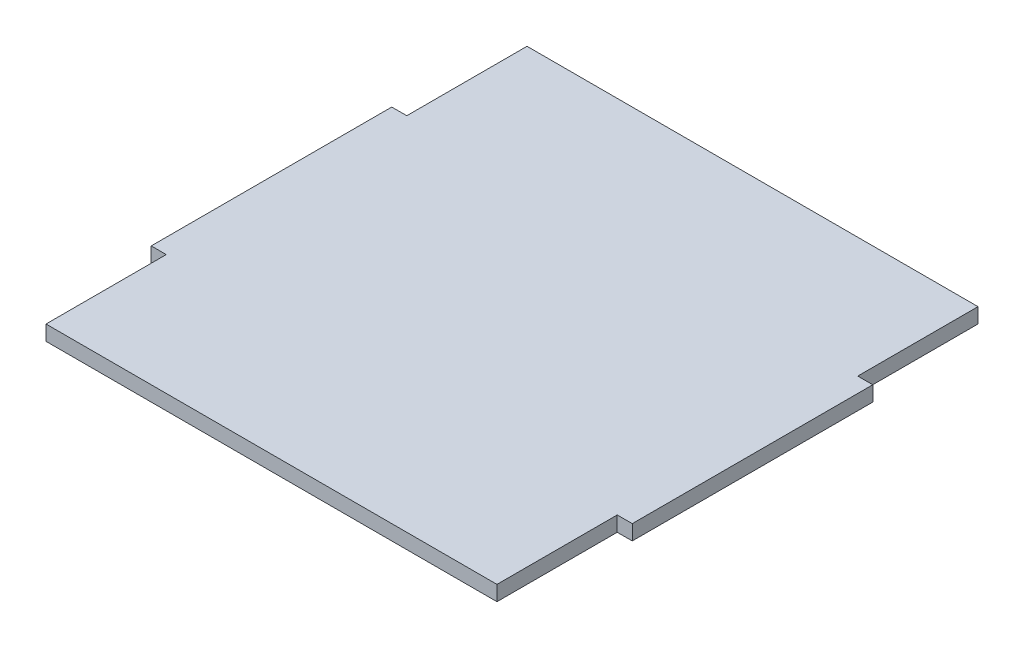
ISO-10303-21;
HEADER;
FILE_DESCRIPTION(('STEP AP214'),'2;1');
FILE_NAME('part.step','',(''),(''),'','','');
FILE_SCHEMA(('AUTOMOTIVE_DESIGN { 1 0 10303 214 1 1 1 1 }'));
ENDSEC;
DATA;
#1=APPLICATION_CONTEXT('core data for automotive mechanical design processes');
#2=APPLICATION_PROTOCOL_DEFINITION('international standard','automotive_design',2000,#1);
#3=PRODUCT_CONTEXT('',#1,'mechanical');
#4=PRODUCT('Part','Part','',(#3));
#5=PRODUCT_RELATED_PRODUCT_CATEGORY('part','',(#4));
#6=PRODUCT_DEFINITION_FORMATION('','',#4);
#7=PRODUCT_DEFINITION_CONTEXT('part definition',#1,'design');
#8=PRODUCT_DEFINITION('design','',#6,#7);
#9=PRODUCT_DEFINITION_SHAPE('','',#8);
#10=(LENGTH_UNIT() NAMED_UNIT(*) SI_UNIT(.MILLI.,.METRE.));
#11=(NAMED_UNIT(*) PLANE_ANGLE_UNIT() SI_UNIT($,.RADIAN.));
#12=(NAMED_UNIT(*) SI_UNIT($,.STERADIAN.) SOLID_ANGLE_UNIT());
#13=UNCERTAINTY_MEASURE_WITH_UNIT(LENGTH_MEASURE(1.E-05),#10,'distance_accuracy_value','');
#14=(GEOMETRIC_REPRESENTATION_CONTEXT(3) GLOBAL_UNCERTAINTY_ASSIGNED_CONTEXT((#13)) GLOBAL_UNIT_ASSIGNED_CONTEXT((#10,
#11,#12)) REPRESENTATION_CONTEXT('',''));
#15=CARTESIAN_POINT('',(0.,0.,0.));
#16=DIRECTION('',(0.,0.,1.));
#17=DIRECTION('',(1.,0.,0.));
#18=AXIS2_PLACEMENT_3D('',#15,#16,#17);
#19=CARTESIAN_POINT('',(98.425,3.175,0.));
#20=DIRECTION('',(1.,0.,0.));
#21=DIRECTION('',(0.,0.,-1.));
#22=AXIS2_PLACEMENT_3D('',#19,#20,#21);
#23=PLANE('',#22);
#24=DIRECTION('',(0.,0.,1.));
#25=VECTOR('',#24,1.);
#26=CARTESIAN_POINT('',(98.425,0.,0.));
#27=LINE('',#26,#25);
#28=CARTESIAN_POINT('',(98.425,0.,-101.6));
#29=VERTEX_POINT('',#28);
#30=CARTESIAN_POINT('',(98.425,0.,-76.2));
#31=VERTEX_POINT('',#30);
#32=EDGE_CURVE('E150',#29,#31,#27,.T.);
#33=ORIENTED_EDGE('',*,*,#32,.F.);
#34=DIRECTION('',(0.,-1.,0.));
#35=VECTOR('',#34,1.);
#36=CARTESIAN_POINT('',(98.425,3.175,-101.6));
#37=LINE('',#36,#35);
#38=CARTESIAN_POINT('',(98.425,3.175,-101.6));
#39=VERTEX_POINT('',#38);
#40=EDGE_CURVE('E11',#39,#29,#37,.T.);
#41=ORIENTED_EDGE('',*,*,#40,.F.);
#42=DIRECTION('',(0.,0.,1.));
#43=VECTOR('',#42,1.);
#44=CARTESIAN_POINT('',(98.425,3.175,0.));
#45=LINE('',#44,#43);
#46=CARTESIAN_POINT('',(98.425,3.175,-76.2));
#47=VERTEX_POINT('',#46);
#48=EDGE_CURVE('E178',#39,#47,#45,.T.);
#49=ORIENTED_EDGE('',*,*,#48,.T.);
#50=DIRECTION('',(0.,-1.,0.));
#51=VECTOR('',#50,1.);
#52=CARTESIAN_POINT('',(98.425,3.175,-76.2));
#53=LINE('',#52,#51);
#54=EDGE_CURVE('E95',#47,#31,#53,.T.);
#55=ORIENTED_EDGE('',*,*,#54,.T.);
#56=EDGE_LOOP('',(#33,#41,#49,#55));
#57=FACE_BOUND('',#56,.T.);
#58=ADVANCED_FACE('F33',(#57),#23,.T.);
#59=CARTESIAN_POINT('',(0.,3.175,-101.6));
#60=DIRECTION('',(0.,0.,-1.));
#61=DIRECTION('',(-1.,0.,0.));
#62=AXIS2_PLACEMENT_3D('',#59,#60,#61);
#63=PLANE('',#62);
#64=DIRECTION('',(1.,0.,0.));
#65=VECTOR('',#64,1.);
#66=CARTESIAN_POINT('',(0.,0.,-101.6));
#67=LINE('',#66,#65);
#68=CARTESIAN_POINT('',(3.175,0.,-101.6));
#69=VERTEX_POINT('',#68);
#70=EDGE_CURVE('E153',#69,#29,#67,.T.);
#71=ORIENTED_EDGE('',*,*,#70,.F.);
#72=DIRECTION('',(0.,-1.,0.));
#73=VECTOR('',#72,1.);
#74=CARTESIAN_POINT('',(3.175,3.175,-101.6));
#75=LINE('',#74,#73);
#76=CARTESIAN_POINT('',(3.175,3.175,-101.6));
#77=VERTEX_POINT('',#76);
#78=EDGE_CURVE('E41',#77,#69,#75,.T.);
#79=ORIENTED_EDGE('',*,*,#78,.F.);
#80=DIRECTION('',(1.,0.,0.));
#81=VECTOR('',#80,1.);
#82=CARTESIAN_POINT('',(0.,3.175,-101.6));
#83=LINE('',#82,#81);
#84=EDGE_CURVE('E219',#77,#39,#83,.T.);
#85=ORIENTED_EDGE('',*,*,#84,.T.);
#86=ORIENTED_EDGE('',*,*,#40,.T.);
#87=EDGE_LOOP('',(#71,#79,#85,#86));
#88=FACE_BOUND('',#87,.T.);
#89=ADVANCED_FACE('F206',(#88),#63,.T.);
#90=CARTESIAN_POINT('',(3.175,3.175,0.));
#91=DIRECTION('',(-1.,0.,0.));
#92=DIRECTION('',(0.,0.,1.));
#93=AXIS2_PLACEMENT_3D('',#90,#91,#92);
#94=PLANE('',#93);
#95=DIRECTION('',(0.,0.,-1.));
#96=VECTOR('',#95,1.);
#97=CARTESIAN_POINT('',(3.175,0.,0.));
#98=LINE('',#97,#96);
#99=CARTESIAN_POINT('',(3.175,0.,-76.2));
#100=VERTEX_POINT('',#99);
#101=EDGE_CURVE('E156',#100,#69,#98,.T.);
#102=ORIENTED_EDGE('',*,*,#101,.F.);
#103=DIRECTION('',(0.,-1.,0.));
#104=VECTOR('',#103,1.);
#105=CARTESIAN_POINT('',(3.175,3.175,-76.2));
#106=LINE('',#105,#104);
#107=CARTESIAN_POINT('',(3.175,3.175,-76.2));
#108=VERTEX_POINT('',#107);
#109=EDGE_CURVE('E195',#108,#100,#106,.T.);
#110=ORIENTED_EDGE('',*,*,#109,.F.);
#111=DIRECTION('',(0.,0.,-1.));
#112=VECTOR('',#111,1.);
#113=CARTESIAN_POINT('',(3.175,3.175,0.));
#114=LINE('',#113,#112);
#115=EDGE_CURVE('E202',#108,#77,#114,.T.);
#116=ORIENTED_EDGE('',*,*,#115,.T.);
#117=ORIENTED_EDGE('',*,*,#78,.T.);
#118=EDGE_LOOP('',(#102,#110,#116,#117));
#119=FACE_BOUND('',#118,.T.);
#120=ADVANCED_FACE('F200',(#119),#94,.T.);
#121=CARTESIAN_POINT('',(0.,3.175,-76.2));
#122=DIRECTION('',(0.,0.,-1.));
#123=DIRECTION('',(-1.,0.,0.));
#124=AXIS2_PLACEMENT_3D('',#121,#122,#123);
#125=PLANE('',#124);
#126=DIRECTION('',(1.,0.,0.));
#127=VECTOR('',#126,1.);
#128=CARTESIAN_POINT('',(0.,0.,-76.2));
#129=LINE('',#128,#127);
#130=CARTESIAN_POINT('',(0.,0.,-76.2));
#131=VERTEX_POINT('',#130);
#132=EDGE_CURVE('E159',#131,#100,#129,.T.);
#133=ORIENTED_EDGE('',*,*,#132,.F.);
#134=DIRECTION('',(0.,-1.,0.));
#135=VECTOR('',#134,1.);
#136=CARTESIAN_POINT('',(0.,3.175,-76.2));
#137=LINE('',#136,#135);
#138=CARTESIAN_POINT('',(0.,3.175,-76.2));
#139=VERTEX_POINT('',#138);
#140=EDGE_CURVE('E193',#139,#131,#137,.T.);
#141=ORIENTED_EDGE('',*,*,#140,.F.);
#142=DIRECTION('',(1.,0.,0.));
#143=VECTOR('',#142,1.);
#144=CARTESIAN_POINT('',(0.,3.175,-76.2));
#145=LINE('',#144,#143);
#146=EDGE_CURVE('E216',#139,#108,#145,.T.);
#147=ORIENTED_EDGE('',*,*,#146,.T.);
#148=ORIENTED_EDGE('',*,*,#109,.T.);
#149=EDGE_LOOP('',(#133,#141,#147,#148));
#150=FACE_BOUND('',#149,.T.);
#151=ADVANCED_FACE('F213',(#150),#125,.T.);
#152=CARTESIAN_POINT('',(0.,3.175,0.));
#153=DIRECTION('',(-1.,0.,0.));
#154=DIRECTION('',(0.,0.,1.));
#155=AXIS2_PLACEMENT_3D('',#152,#153,#154);
#156=PLANE('',#155);
#157=DIRECTION('',(0.,0.,-1.));
#158=VECTOR('',#157,1.);
#159=CARTESIAN_POINT('',(0.,0.,0.));
#160=LINE('',#159,#158);
#161=CARTESIAN_POINT('',(0.,0.,-25.4));
#162=VERTEX_POINT('',#161);
#163=EDGE_CURVE('E162',#162,#131,#160,.T.);
#164=ORIENTED_EDGE('',*,*,#163,.F.);
#165=DIRECTION('',(0.,-1.,0.));
#166=VECTOR('',#165,1.);
#167=CARTESIAN_POINT('',(0.,3.175,-25.4));
#168=LINE('',#167,#166);
#169=CARTESIAN_POINT('',(0.,3.175,-25.4));
#170=VERTEX_POINT('',#169);
#171=EDGE_CURVE('E191',#170,#162,#168,.T.);
#172=ORIENTED_EDGE('',*,*,#171,.F.);
#173=DIRECTION('',(0.,0.,-1.));
#174=VECTOR('',#173,1.);
#175=CARTESIAN_POINT('',(0.,3.175,0.));
#176=LINE('',#175,#174);
#177=EDGE_CURVE('E221',#170,#139,#176,.T.);
#178=ORIENTED_EDGE('',*,*,#177,.T.);
#179=ORIENTED_EDGE('',*,*,#140,.T.);
#180=EDGE_LOOP('',(#164,#172,#178,#179));
#181=FACE_BOUND('',#180,.T.);
#182=ADVANCED_FACE('F254',(#181),#156,.T.);
#183=CARTESIAN_POINT('',(0.,3.175,-25.4));
#184=DIRECTION('',(0.,0.,-1.));
#185=DIRECTION('',(-1.,0.,0.));
#186=AXIS2_PLACEMENT_3D('',#183,#184,#185);
#187=PLANE('',#186);
#188=DIRECTION('',(1.,0.,0.));
#189=VECTOR('',#188,1.);
#190=CARTESIAN_POINT('',(0.,0.,-25.4));
#191=LINE('',#190,#189);
#192=CARTESIAN_POINT('',(3.175,0.,-25.4));
#193=VERTEX_POINT('',#192);
#194=EDGE_CURVE('E165',#162,#193,#191,.T.);
#195=ORIENTED_EDGE('',*,*,#194,.T.);
#196=DIRECTION('',(0.,-1.,0.));
#197=VECTOR('',#196,1.);
#198=CARTESIAN_POINT('',(3.175,3.175,-25.4));
#199=LINE('',#198,#197);
#200=CARTESIAN_POINT('',(3.175,3.175,-25.4));
#201=VERTEX_POINT('',#200);
#202=EDGE_CURVE('E188',#201,#193,#199,.T.);
#203=ORIENTED_EDGE('',*,*,#202,.F.);
#204=DIRECTION('',(1.,0.,0.));
#205=VECTOR('',#204,1.);
#206=CARTESIAN_POINT('',(0.,3.175,-25.4));
#207=LINE('',#206,#205);
#208=EDGE_CURVE('E227',#170,#201,#207,.T.);
#209=ORIENTED_EDGE('',*,*,#208,.F.);
#210=ORIENTED_EDGE('',*,*,#171,.T.);
#211=EDGE_LOOP('',(#195,#203,#209,#210));
#212=FACE_BOUND('',#211,.T.);
#213=ADVANCED_FACE('F257',(#212),#187,.F.);
#214=CARTESIAN_POINT('',(3.175,3.175,0.));
#215=DIRECTION('',(1.,0.,0.));
#216=DIRECTION('',(0.,0.,-1.));
#217=AXIS2_PLACEMENT_3D('',#214,#215,#216);
#218=PLANE('',#217);
#219=DIRECTION('',(0.,0.,1.));
#220=VECTOR('',#219,1.);
#221=CARTESIAN_POINT('',(3.175,0.,0.));
#222=LINE('',#221,#220);
#223=CARTESIAN_POINT('',(3.175,0.,0.));
#224=VERTEX_POINT('',#223);
#225=EDGE_CURVE('E167',#193,#224,#222,.T.);
#226=ORIENTED_EDGE('',*,*,#225,.T.);
#227=DIRECTION('',(0.,-1.,0.));
#228=VECTOR('',#227,1.);
#229=CARTESIAN_POINT('',(3.175,3.175,0.));
#230=LINE('',#229,#228);
#231=CARTESIAN_POINT('',(3.175,3.175,0.));
#232=VERTEX_POINT('',#231);
#233=EDGE_CURVE('E185',#232,#224,#230,.T.);
#234=ORIENTED_EDGE('',*,*,#233,.F.);
#235=DIRECTION('',(0.,0.,1.));
#236=VECTOR('',#235,1.);
#237=CARTESIAN_POINT('',(3.175,3.175,0.));
#238=LINE('',#237,#236);
#239=EDGE_CURVE('E229',#201,#232,#238,.T.);
#240=ORIENTED_EDGE('',*,*,#239,.F.);
#241=ORIENTED_EDGE('',*,*,#202,.T.);
#242=EDGE_LOOP('',(#226,#234,#240,#241));
#243=FACE_BOUND('',#242,.T.);
#244=ADVANCED_FACE('F261',(#243),#218,.F.);
#245=CARTESIAN_POINT('',(0.,3.175,0.));
#246=DIRECTION('',(0.,0.,-1.));
#247=DIRECTION('',(-1.,0.,0.));
#248=AXIS2_PLACEMENT_3D('',#245,#246,#247);
#249=PLANE('',#248);
#250=DIRECTION('',(1.,0.,0.));
#251=VECTOR('',#250,1.);
#252=CARTESIAN_POINT('',(0.,0.,0.));
#253=LINE('',#252,#251);
#254=CARTESIAN_POINT('',(98.425,0.,0.));
#255=VERTEX_POINT('',#254);
#256=EDGE_CURVE('E169',#224,#255,#253,.T.);
#257=ORIENTED_EDGE('',*,*,#256,.T.);
#258=DIRECTION('',(0.,-1.,0.));
#259=VECTOR('',#258,1.);
#260=CARTESIAN_POINT('',(98.425,3.175,0.));
#261=LINE('',#260,#259);
#262=CARTESIAN_POINT('',(98.425,3.175,0.));
#263=VERTEX_POINT('',#262);
#264=EDGE_CURVE('E182',#263,#255,#261,.T.);
#265=ORIENTED_EDGE('',*,*,#264,.F.);
#266=DIRECTION('',(1.,0.,0.));
#267=VECTOR('',#266,1.);
#268=CARTESIAN_POINT('',(0.,3.175,0.));
#269=LINE('',#268,#267);
#270=EDGE_CURVE('E145',#232,#263,#269,.T.);
#271=ORIENTED_EDGE('',*,*,#270,.F.);
#272=ORIENTED_EDGE('',*,*,#233,.T.);
#273=EDGE_LOOP('',(#257,#265,#271,#272));
#274=FACE_BOUND('',#273,.T.);
#275=ADVANCED_FACE('F235',(#274),#249,.F.);
#276=CARTESIAN_POINT('',(98.425,3.175,0.));
#277=DIRECTION('',(-1.,0.,0.));
#278=DIRECTION('',(0.,0.,1.));
#279=AXIS2_PLACEMENT_3D('',#276,#277,#278);
#280=PLANE('',#279);
#281=DIRECTION('',(0.,0.,-1.));
#282=VECTOR('',#281,1.);
#283=CARTESIAN_POINT('',(98.425,0.,0.));
#284=LINE('',#283,#282);
#285=CARTESIAN_POINT('',(98.425,0.,-25.4));
#286=VERTEX_POINT('',#285);
#287=EDGE_CURVE('E171',#255,#286,#284,.T.);
#288=ORIENTED_EDGE('',*,*,#287,.T.);
#289=DIRECTION('',(0.,-1.,0.));
#290=VECTOR('',#289,1.);
#291=CARTESIAN_POINT('',(98.425,3.175,-25.4));
#292=LINE('',#291,#290);
#293=CARTESIAN_POINT('',(98.425,3.175,-25.4));
#294=VERTEX_POINT('',#293);
#295=EDGE_CURVE('E134',#294,#286,#292,.T.);
#296=ORIENTED_EDGE('',*,*,#295,.F.);
#297=DIRECTION('',(0.,0.,-1.));
#298=VECTOR('',#297,1.);
#299=CARTESIAN_POINT('',(98.425,3.175,0.));
#300=LINE('',#299,#298);
#301=EDGE_CURVE('E142',#263,#294,#300,.T.);
#302=ORIENTED_EDGE('',*,*,#301,.F.);
#303=ORIENTED_EDGE('',*,*,#264,.T.);
#304=EDGE_LOOP('',(#288,#296,#302,#303));
#305=FACE_BOUND('',#304,.T.);
#306=ADVANCED_FACE('F239',(#305),#280,.F.);
#307=CARTESIAN_POINT('',(0.,3.175,-25.4));
#308=DIRECTION('',(0.,0.,1.));
#309=DIRECTION('',(1.,0.,0.));
#310=AXIS2_PLACEMENT_3D('',#307,#308,#309);
#311=PLANE('',#310);
#312=DIRECTION('',(-1.,0.,0.));
#313=VECTOR('',#312,1.);
#314=CARTESIAN_POINT('',(0.,0.,-25.4));
#315=LINE('',#314,#313);
#316=CARTESIAN_POINT('',(101.6,0.,-25.4));
#317=VERTEX_POINT('',#316);
#318=EDGE_CURVE('E133',#317,#286,#315,.T.);
#319=ORIENTED_EDGE('',*,*,#318,.F.);
#320=DIRECTION('',(0.,-1.,0.));
#321=VECTOR('',#320,1.);
#322=CARTESIAN_POINT('',(101.6,3.175,-25.4));
#323=LINE('',#322,#321);
#324=CARTESIAN_POINT('',(101.6,3.175,-25.4));
#325=VERTEX_POINT('',#324);
#326=EDGE_CURVE('E127',#325,#317,#323,.T.);
#327=ORIENTED_EDGE('',*,*,#326,.F.);
#328=DIRECTION('',(-1.,0.,0.));
#329=VECTOR('',#328,1.);
#330=CARTESIAN_POINT('',(0.,3.175,-25.4));
#331=LINE('',#330,#329);
#332=EDGE_CURVE('E131',#325,#294,#331,.T.);
#333=ORIENTED_EDGE('',*,*,#332,.T.);
#334=ORIENTED_EDGE('',*,*,#295,.T.);
#335=EDGE_LOOP('',(#319,#327,#333,#334));
#336=FACE_BOUND('',#335,.T.);
#337=ADVANCED_FACE('F129',(#336),#311,.T.);
#338=CARTESIAN_POINT('',(101.6,3.175,0.));
#339=DIRECTION('',(-1.,0.,0.));
#340=DIRECTION('',(0.,0.,1.));
#341=AXIS2_PLACEMENT_3D('',#338,#339,#340);
#342=PLANE('',#341);
#343=DIRECTION('',(0.,0.,-1.));
#344=VECTOR('',#343,1.);
#345=CARTESIAN_POINT('',(101.6,0.,0.));
#346=LINE('',#345,#344);
#347=CARTESIAN_POINT('',(101.6,0.,-76.2));
#348=VERTEX_POINT('',#347);
#349=EDGE_CURVE('E88',#317,#348,#346,.T.);
#350=ORIENTED_EDGE('',*,*,#349,.T.);
#351=DIRECTION('',(0.,-1.,0.));
#352=VECTOR('',#351,1.);
#353=CARTESIAN_POINT('',(101.6,3.175,-76.2));
#354=LINE('',#353,#352);
#355=CARTESIAN_POINT('',(101.6,3.175,-76.2));
#356=VERTEX_POINT('',#355);
#357=EDGE_CURVE('E135',#356,#348,#354,.T.);
#358=ORIENTED_EDGE('',*,*,#357,.F.);
#359=DIRECTION('',(0.,0.,-1.));
#360=VECTOR('',#359,1.);
#361=CARTESIAN_POINT('',(101.6,3.175,0.));
#362=LINE('',#361,#360);
#363=EDGE_CURVE('E137',#325,#356,#362,.T.);
#364=ORIENTED_EDGE('',*,*,#363,.F.);
#365=ORIENTED_EDGE('',*,*,#326,.T.);
#366=EDGE_LOOP('',(#350,#358,#364,#365));
#367=FACE_BOUND('',#366,.T.);
#368=ADVANCED_FACE('F138',(#367),#342,.F.);
#369=CARTESIAN_POINT('',(0.,3.175,-76.2));
#370=DIRECTION('',(0.,0.,1.));
#371=DIRECTION('',(1.,0.,0.));
#372=AXIS2_PLACEMENT_3D('',#369,#370,#371);
#373=PLANE('',#372);
#374=DIRECTION('',(-1.,0.,0.));
#375=VECTOR('',#374,1.);
#376=CARTESIAN_POINT('',(0.,0.,-76.2));
#377=LINE('',#376,#375);
#378=EDGE_CURVE('E176',#348,#31,#377,.T.);
#379=ORIENTED_EDGE('',*,*,#378,.T.);
#380=ORIENTED_EDGE('',*,*,#54,.F.);
#381=DIRECTION('',(-1.,0.,0.));
#382=VECTOR('',#381,1.);
#383=CARTESIAN_POINT('',(0.,3.175,-76.2));
#384=LINE('',#383,#382);
#385=EDGE_CURVE('E49',#356,#47,#384,.T.);
#386=ORIENTED_EDGE('',*,*,#385,.F.);
#387=ORIENTED_EDGE('',*,*,#357,.T.);
#388=EDGE_LOOP('',(#379,#380,#386,#387));
#389=FACE_BOUND('',#388,.T.);
#390=ADVANCED_FACE('F242',(#389),#373,.F.);
#391=CARTESIAN_POINT('',(0.,3.175,0.));
#392=DIRECTION('',(0.,1.,0.));
#393=DIRECTION('',(0.,0.,1.));
#394=AXIS2_PLACEMENT_3D('',#391,#392,#393);
#395=PLANE('',#394);
#396=ORIENTED_EDGE('',*,*,#48,.F.);
#397=ORIENTED_EDGE('',*,*,#84,.F.);
#398=ORIENTED_EDGE('',*,*,#115,.F.);
#399=ORIENTED_EDGE('',*,*,#146,.F.);
#400=ORIENTED_EDGE('',*,*,#177,.F.);
#401=ORIENTED_EDGE('',*,*,#208,.T.);
#402=ORIENTED_EDGE('',*,*,#239,.T.);
#403=ORIENTED_EDGE('',*,*,#270,.T.);
#404=ORIENTED_EDGE('',*,*,#301,.T.);
#405=ORIENTED_EDGE('',*,*,#332,.F.);
#406=ORIENTED_EDGE('',*,*,#363,.T.);
#407=ORIENTED_EDGE('',*,*,#385,.T.);
#408=EDGE_LOOP('',(#396,#397,#398,#399,#400,#401,#402,#403,#404,#405,#406,#407));
#409=FACE_BOUND('',#408,.T.);
#410=ADVANCED_FACE('F140',(#409),#395,.T.);
#411=CARTESIAN_POINT('',(0.,0.,0.));
#412=DIRECTION('',(0.,1.,0.));
#413=DIRECTION('',(0.,0.,1.));
#414=AXIS2_PLACEMENT_3D('',#411,#412,#413);
#415=PLANE('',#414);
#416=ORIENTED_EDGE('',*,*,#32,.T.);
#417=ORIENTED_EDGE('',*,*,#378,.F.);
#418=ORIENTED_EDGE('',*,*,#349,.F.);
#419=ORIENTED_EDGE('',*,*,#318,.T.);
#420=ORIENTED_EDGE('',*,*,#287,.F.);
#421=ORIENTED_EDGE('',*,*,#256,.F.);
#422=ORIENTED_EDGE('',*,*,#225,.F.);
#423=ORIENTED_EDGE('',*,*,#194,.F.);
#424=ORIENTED_EDGE('',*,*,#163,.T.);
#425=ORIENTED_EDGE('',*,*,#132,.T.);
#426=ORIENTED_EDGE('',*,*,#101,.T.);
#427=ORIENTED_EDGE('',*,*,#70,.T.);
#428=EDGE_LOOP('',(#416,#417,#418,#419,#420,#421,#422,#423,#424,#425,#426,#427));
#429=FACE_BOUND('',#428,.T.);
#430=ADVANCED_FACE('F208',(#429),#415,.F.);
#431=CLOSED_SHELL('',(#58,#89,#120,#151,#182,#213,#244,#275,#306,#337,#368,#390,#410,#430));
#432=MANIFOLD_SOLID_BREP('B2',#431);
#433=ADVANCED_BREP_SHAPE_REPRESENTATION('',(#18,#432),#14);
#434=SHAPE_DEFINITION_REPRESENTATION(#9,#433);
ENDSEC;
END-ISO-10303-21;
